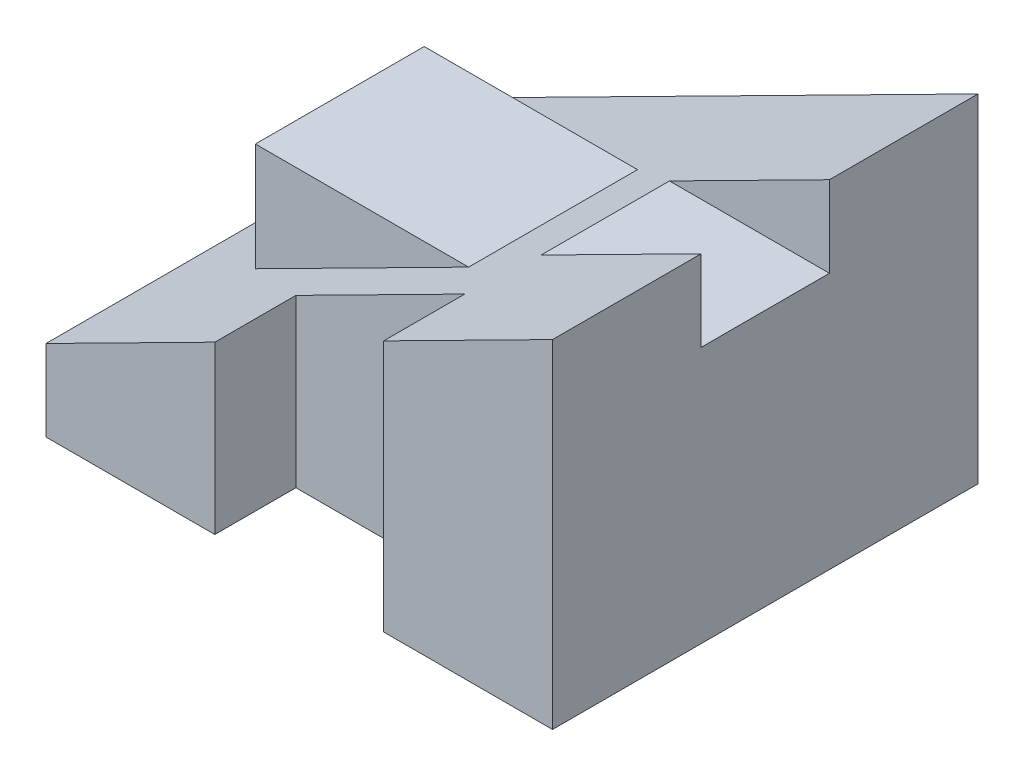
ISO-10303-21;
HEADER;
FILE_DESCRIPTION(('STEP AP214'),'2;1');
FILE_NAME('part.step','',(''),(''),'','','');
FILE_SCHEMA(('AUTOMOTIVE_DESIGN { 1 0 10303 214 1 1 1 1 }'));
ENDSEC;
DATA;
#1=APPLICATION_CONTEXT('core data for automotive mechanical design processes');
#2=APPLICATION_PROTOCOL_DEFINITION('international standard','automotive_design',2000,#1);
#3=PRODUCT_CONTEXT('',#1,'mechanical');
#4=PRODUCT('Part','Part','',(#3));
#5=PRODUCT_RELATED_PRODUCT_CATEGORY('part','',(#4));
#6=PRODUCT_DEFINITION_FORMATION('','',#4);
#7=PRODUCT_DEFINITION_CONTEXT('part definition',#1,'design');
#8=PRODUCT_DEFINITION('design','',#6,#7);
#9=PRODUCT_DEFINITION_SHAPE('','',#8);
#10=(LENGTH_UNIT() NAMED_UNIT(*) SI_UNIT(.MILLI.,.METRE.));
#11=(NAMED_UNIT(*) PLANE_ANGLE_UNIT() SI_UNIT($,.RADIAN.));
#12=(NAMED_UNIT(*) SI_UNIT($,.STERADIAN.) SOLID_ANGLE_UNIT());
#13=UNCERTAINTY_MEASURE_WITH_UNIT(LENGTH_MEASURE(1.E-05),#10,'distance_accuracy_value','');
#14=(GEOMETRIC_REPRESENTATION_CONTEXT(3) GLOBAL_UNCERTAINTY_ASSIGNED_CONTEXT((#13)) GLOBAL_UNIT_ASSIGNED_CONTEXT((#10,
#11,#12)) REPRESENTATION_CONTEXT('',''));
#15=CARTESIAN_POINT('',(0.,0.,0.));
#16=DIRECTION('',(0.,0.,1.));
#17=DIRECTION('',(1.,0.,0.));
#18=AXIS2_PLACEMENT_3D('',#15,#16,#17);
#19=CARTESIAN_POINT('',(0.,38.,-63.));
#20=DIRECTION('',(0.,1.,0.));
#21=DIRECTION('',(0.,0.,1.));
#22=AXIS2_PLACEMENT_3D('',#19,#20,#21);
#23=PLANE('',#22);
#24=DIRECTION('',(0.,0.,1.));
#25=VECTOR('',#24,1.);
#26=CARTESIAN_POINT('',(-23.6842105263158,38.,-63.));
#27=LINE('',#26,#25);
#28=CARTESIAN_POINT('',(-23.6842105263158,38.,-41.));
#29=VERTEX_POINT('',#28);
#30=CARTESIAN_POINT('',(-23.6842105263158,38.,-22.));
#31=VERTEX_POINT('',#30);
#32=EDGE_CURVE('E163',#29,#31,#27,.T.);
#33=ORIENTED_EDGE('',*,*,#32,.T.);
#34=DIRECTION('',(-1.,0.,0.));
#35=VECTOR('',#34,1.);
#36=CARTESIAN_POINT('',(0.,38.,-22.));
#37=LINE('',#36,#35);
#38=CARTESIAN_POINT('',(0.,38.,-22.));
#39=VERTEX_POINT('',#38);
#40=EDGE_CURVE('E151',#39,#31,#37,.T.);
#41=ORIENTED_EDGE('',*,*,#40,.F.);
#42=DIRECTION('',(0.,0.,1.));
#43=VECTOR('',#42,1.);
#44=CARTESIAN_POINT('',(0.,38.,-63.));
#45=LINE('',#44,#43);
#46=CARTESIAN_POINT('',(0.,38.,-41.));
#47=VERTEX_POINT('',#46);
#48=EDGE_CURVE('E161',#47,#39,#45,.T.);
#49=ORIENTED_EDGE('',*,*,#48,.F.);
#50=DIRECTION('',(-1.,0.,0.));
#51=VECTOR('',#50,1.);
#52=CARTESIAN_POINT('',(0.,38.,-41.));
#53=LINE('',#52,#51);
#54=EDGE_CURVE('E477',#47,#29,#53,.T.);
#55=ORIENTED_EDGE('',*,*,#54,.T.);
#56=EDGE_LOOP('',(#33,#41,#49,#55));
#57=FACE_BOUND('',#56,.T.);
#58=ADVANCED_FACE('F43',(#57),#23,.T.);
#59=CARTESIAN_POINT('',(-20.1584382515207,39.7863912858962,-63.));
#60=DIRECTION('',(0.451964793188669,-0.892035776030268,0.));
#61=DIRECTION('',(0.892035776030269,0.45196479318867,0.));
#62=AXIS2_PLACEMENT_3D('',#59,#60,#61);
#63=PLANE('',#62);
#64=DIRECTION('',(0.892035776030269,0.45196479318867,0.));
#65=VECTOR('',#64,1.);
#66=CARTESIAN_POINT('',(-20.1584382515207,39.7863912858962,0.));
#67=LINE('',#66,#65);
#68=CARTESIAN_POINT('',(-75.,12.,0.));
#69=VERTEX_POINT('',#68);
#70=CARTESIAN_POINT('',(-50.,24.6666666666667,0.));
#71=VERTEX_POINT('',#70);
#72=EDGE_CURVE('E202',#69,#71,#67,.T.);
#73=ORIENTED_EDGE('',*,*,#72,.T.);
#74=DIRECTION('',(0.,0.,1.));
#75=VECTOR('',#74,1.);
#76=CARTESIAN_POINT('',(-50.,24.6666666666667,-63.));
#77=LINE('',#76,#75);
#78=CARTESIAN_POINT('',(-50.,24.6666666666667,-12.));
#79=VERTEX_POINT('',#78);
#80=EDGE_CURVE('E47',#79,#71,#77,.T.);
#81=ORIENTED_EDGE('',*,*,#80,.F.);
#82=DIRECTION('',(0.892035776030269,0.45196479318867,0.));
#83=VECTOR('',#82,1.);
#84=CARTESIAN_POINT('',(-20.1584382515207,39.7863912858962,-12.));
#85=LINE('',#84,#83);
#86=CARTESIAN_POINT('',(-25.,37.3333333333333,-12.));
#87=VERTEX_POINT('',#86);
#88=EDGE_CURVE('E178',#79,#87,#85,.T.);
#89=ORIENTED_EDGE('',*,*,#88,.T.);
#90=DIRECTION('',(0.,0.,1.));
#91=VECTOR('',#90,1.);
#92=CARTESIAN_POINT('',(-25.,37.3333333333333,-63.));
#93=LINE('',#92,#91);
#94=CARTESIAN_POINT('',(-25.,37.3333333333333,0.));
#95=VERTEX_POINT('',#94);
#96=EDGE_CURVE('E171',#87,#95,#93,.T.);
#97=ORIENTED_EDGE('',*,*,#96,.T.);
#98=DIRECTION('',(0.892035776030269,0.45196479318867,0.));
#99=VECTOR('',#98,1.);
#100=CARTESIAN_POINT('',(-20.1584382515207,39.7863912858962,0.));
#101=LINE('',#100,#99);
#102=CARTESIAN_POINT('',(0.,50.,0.));
#103=VERTEX_POINT('',#102);
#104=EDGE_CURVE('E246',#95,#103,#101,.T.);
#105=ORIENTED_EDGE('',*,*,#104,.T.);
#106=DIRECTION('',(0.,0.,1.));
#107=VECTOR('',#106,1.);
#108=CARTESIAN_POINT('',(0.,50.,-22.));
#109=LINE('',#108,#107);
#110=CARTESIAN_POINT('',(0.,50.,-22.));
#111=VERTEX_POINT('',#110);
#112=EDGE_CURVE('E242',#111,#103,#109,.T.);
#113=ORIENTED_EDGE('',*,*,#112,.F.);
#114=DIRECTION('',(0.892035776030269,0.45196479318867,0.));
#115=VECTOR('',#114,1.);
#116=CARTESIAN_POINT('',(-20.1584382515207,39.7863912858962,-22.));
#117=LINE('',#116,#115);
#118=EDGE_CURVE('E153',#31,#111,#117,.T.);
#119=ORIENTED_EDGE('',*,*,#118,.F.);
#120=ORIENTED_EDGE('',*,*,#32,.F.);
#121=DIRECTION('',(0.892035776030269,0.45196479318867,0.));
#122=VECTOR('',#121,1.);
#123=CARTESIAN_POINT('',(-20.1584382515207,39.7863912858962,-41.));
#124=LINE('',#123,#122);
#125=CARTESIAN_POINT('',(0.,50.,-41.));
#126=VERTEX_POINT('',#125);
#127=EDGE_CURVE('E60',#29,#126,#124,.T.);
#128=ORIENTED_EDGE('',*,*,#127,.T.);
#129=DIRECTION('',(0.,0.,1.));
#130=VECTOR('',#129,1.);
#131=CARTESIAN_POINT('',(0.,50.,-63.));
#132=LINE('',#131,#130);
#133=CARTESIAN_POINT('',(0.,50.,-63.));
#134=VERTEX_POINT('',#133);
#135=EDGE_CURVE('E484',#134,#126,#132,.T.);
#136=ORIENTED_EDGE('',*,*,#135,.F.);
#137=DIRECTION('',(0.892035776030269,0.45196479318867,0.));
#138=VECTOR('',#137,1.);
#139=CARTESIAN_POINT('',(-20.1584382515207,39.7863912858962,-63.));
#140=LINE('',#139,#138);
#141=CARTESIAN_POINT('',(-75.,12.,-63.));
#142=VERTEX_POINT('',#141);
#143=EDGE_CURVE('E192',#142,#134,#140,.T.);
#144=ORIENTED_EDGE('',*,*,#143,.F.);
#145=DIRECTION('',(0.,0.,1.));
#146=VECTOR('',#145,1.);
#147=CARTESIAN_POINT('',(-75.,12.,-63.));
#148=LINE('',#147,#146);
#149=EDGE_CURVE('E209',#142,#69,#148,.T.);
#150=ORIENTED_EDGE('',*,*,#149,.T.);
#151=EDGE_LOOP('',(#73,#81,#89,#97,#105,#113,#119,#120,#128,#136,#144,#150));
#152=FACE_BOUND('',#151,.T.);
#153=DIRECTION('',(0.892035776030269,0.45196479318867,0.));
#154=VECTOR('',#153,1.);
#155=CARTESIAN_POINT('',(-20.1584382515207,39.7863912858962,-19.));
#156=LINE('',#155,#154);
#157=CARTESIAN_POINT('',(-63.,18.08,-19.));
#158=VERTEX_POINT('',#157);
#159=CARTESIAN_POINT('',(-31.421052631579,34.08,-19.));
#160=VERTEX_POINT('',#159);
#161=EDGE_CURVE('E68',#158,#160,#156,.T.);
#162=ORIENTED_EDGE('',*,*,#161,.F.);
#163=DIRECTION('',(0.,0.,1.));
#164=VECTOR('',#163,1.);
#165=CARTESIAN_POINT('',(-63.,18.08,-44.));
#166=LINE('',#165,#164);
#167=CARTESIAN_POINT('',(-63.,18.08,-44.));
#168=VERTEX_POINT('',#167);
#169=EDGE_CURVE('E252',#168,#158,#166,.T.);
#170=ORIENTED_EDGE('',*,*,#169,.F.);
#171=DIRECTION('',(0.892035776030269,0.45196479318867,0.));
#172=VECTOR('',#171,1.);
#173=CARTESIAN_POINT('',(-20.1584382515207,39.7863912858962,-44.));
#174=LINE('',#173,#172);
#175=CARTESIAN_POINT('',(-31.421052631579,34.08,-44.));
#176=VERTEX_POINT('',#175);
#177=EDGE_CURVE('E491',#168,#176,#174,.T.);
#178=ORIENTED_EDGE('',*,*,#177,.T.);
#179=DIRECTION('',(0.,0.,1.));
#180=VECTOR('',#179,1.);
#181=CARTESIAN_POINT('',(-31.421052631579,34.08,-44.));
#182=LINE('',#181,#180);
#183=EDGE_CURVE('E247',#176,#160,#182,.T.);
#184=ORIENTED_EDGE('',*,*,#183,.T.);
#185=EDGE_LOOP('',(#162,#170,#178,#184));
#186=FACE_BOUND('',#185,.T.);
#187=ADVANCED_FACE('F219',(#152,#186),#63,.F.);
#188=CARTESIAN_POINT('',(-50.,0.,-63.));
#189=DIRECTION('',(-1.,0.,0.));
#190=DIRECTION('',(0.,0.,1.));
#191=AXIS2_PLACEMENT_3D('',#188,#189,#190);
#192=PLANE('',#191);
#193=DIRECTION('',(0.,-1.,0.));
#194=VECTOR('',#193,1.);
#195=CARTESIAN_POINT('',(-50.,0.,-12.));
#196=LINE('',#195,#194);
#197=CARTESIAN_POINT('',(-50.,0.,-12.));
#198=VERTEX_POINT('',#197);
#199=EDGE_CURVE('E181',#79,#198,#196,.T.);
#200=ORIENTED_EDGE('',*,*,#199,.F.);
#201=ORIENTED_EDGE('',*,*,#80,.T.);
#202=DIRECTION('',(0.,-1.,0.));
#203=VECTOR('',#202,1.);
#204=CARTESIAN_POINT('',(-50.,0.,0.));
#205=LINE('',#204,#203);
#206=CARTESIAN_POINT('',(-50.,0.,0.));
#207=VERTEX_POINT('',#206);
#208=EDGE_CURVE('E191',#71,#207,#205,.T.);
#209=ORIENTED_EDGE('',*,*,#208,.T.);
#210=DIRECTION('',(0.,0.,1.));
#211=VECTOR('',#210,1.);
#212=CARTESIAN_POINT('',(-50.,0.,-63.));
#213=LINE('',#212,#211);
#214=EDGE_CURVE('E11',#198,#207,#213,.T.);
#215=ORIENTED_EDGE('',*,*,#214,.F.);
#216=EDGE_LOOP('',(#200,#201,#209,#215));
#217=FACE_BOUND('',#216,.T.);
#218=ADVANCED_FACE('F45',(#217),#192,.F.);
#219=CARTESIAN_POINT('',(0.,0.,-63.));
#220=DIRECTION('',(0.,1.,0.));
#221=DIRECTION('',(0.,0.,1.));
#222=AXIS2_PLACEMENT_3D('',#219,#220,#221);
#223=PLANE('',#222);
#224=DIRECTION('',(-1.,0.,0.));
#225=VECTOR('',#224,1.);
#226=CARTESIAN_POINT('',(0.,0.,0.));
#227=LINE('',#226,#225);
#228=CARTESIAN_POINT('',(-75.,0.,0.));
#229=VERTEX_POINT('',#228);
#230=EDGE_CURVE('E196',#207,#229,#227,.T.);
#231=ORIENTED_EDGE('',*,*,#230,.T.);
#232=DIRECTION('',(0.,0.,1.));
#233=VECTOR('',#232,1.);
#234=CARTESIAN_POINT('',(-75.,0.,-63.));
#235=LINE('',#234,#233);
#236=CARTESIAN_POINT('',(-75.,0.,-63.));
#237=VERTEX_POINT('',#236);
#238=EDGE_CURVE('E52',#237,#229,#235,.T.);
#239=ORIENTED_EDGE('',*,*,#238,.F.);
#240=DIRECTION('',(-1.,0.,0.));
#241=VECTOR('',#240,1.);
#242=CARTESIAN_POINT('',(0.,0.,-63.));
#243=LINE('',#242,#241);
#244=CARTESIAN_POINT('',(0.,0.,-63.));
#245=VERTEX_POINT('',#244);
#246=EDGE_CURVE('E198',#245,#237,#243,.T.);
#247=ORIENTED_EDGE('',*,*,#246,.F.);
#248=DIRECTION('',(0.,0.,1.));
#249=VECTOR('',#248,1.);
#250=CARTESIAN_POINT('',(0.,0.,-63.));
#251=LINE('',#250,#249);
#252=CARTESIAN_POINT('',(0.,0.,0.));
#253=VERTEX_POINT('',#252);
#254=EDGE_CURVE('E182',#245,#253,#251,.T.);
#255=ORIENTED_EDGE('',*,*,#254,.T.);
#256=DIRECTION('',(-1.,0.,0.));
#257=VECTOR('',#256,1.);
#258=CARTESIAN_POINT('',(0.,0.,0.));
#259=LINE('',#258,#257);
#260=CARTESIAN_POINT('',(-25.,0.,0.));
#261=VERTEX_POINT('',#260);
#262=EDGE_CURVE('E174',#253,#261,#259,.T.);
#263=ORIENTED_EDGE('',*,*,#262,.T.);
#264=DIRECTION('',(0.,0.,1.));
#265=VECTOR('',#264,1.);
#266=CARTESIAN_POINT('',(-25.,0.,-63.));
#267=LINE('',#266,#265);
#268=CARTESIAN_POINT('',(-25.,0.,-12.));
#269=VERTEX_POINT('',#268);
#270=EDGE_CURVE('E239',#269,#261,#267,.T.);
#271=ORIENTED_EDGE('',*,*,#270,.F.);
#272=DIRECTION('',(-1.,0.,0.));
#273=VECTOR('',#272,1.);
#274=CARTESIAN_POINT('',(0.,0.,-12.));
#275=LINE('',#274,#273);
#276=EDGE_CURVE('E185',#269,#198,#275,.T.);
#277=ORIENTED_EDGE('',*,*,#276,.T.);
#278=ORIENTED_EDGE('',*,*,#214,.T.);
#279=EDGE_LOOP('',(#231,#239,#247,#255,#263,#271,#277,#278));
#280=FACE_BOUND('',#279,.T.);
#281=ADVANCED_FACE('F227',(#280),#223,.F.);
#282=CARTESIAN_POINT('',(-75.,0.,-63.));
#283=DIRECTION('',(1.,0.,0.));
#284=DIRECTION('',(0.,0.,-1.));
#285=AXIS2_PLACEMENT_3D('',#282,#283,#284);
#286=PLANE('',#285);
#287=DIRECTION('',(0.,1.,0.));
#288=VECTOR('',#287,1.);
#289=CARTESIAN_POINT('',(-75.,0.,0.));
#290=LINE('',#289,#288);
#291=EDGE_CURVE('E205',#229,#69,#290,.T.);
#292=ORIENTED_EDGE('',*,*,#291,.T.);
#293=ORIENTED_EDGE('',*,*,#149,.F.);
#294=DIRECTION('',(0.,1.,0.));
#295=VECTOR('',#294,1.);
#296=CARTESIAN_POINT('',(-75.,0.,-63.));
#297=LINE('',#296,#295);
#298=EDGE_CURVE('E195',#237,#142,#297,.T.);
#299=ORIENTED_EDGE('',*,*,#298,.F.);
#300=ORIENTED_EDGE('',*,*,#238,.T.);
#301=EDGE_LOOP('',(#292,#293,#299,#300));
#302=FACE_BOUND('',#301,.T.);
#303=ADVANCED_FACE('F230',(#302),#286,.F.);
#304=CARTESIAN_POINT('',(0.,0.,-63.));
#305=DIRECTION('',(0.,0.,1.));
#306=DIRECTION('',(1.,0.,0.));
#307=AXIS2_PLACEMENT_3D('',#304,#305,#306);
#308=PLANE('',#307);
#309=ORIENTED_EDGE('',*,*,#143,.T.);
#310=DIRECTION('',(0.,-1.,0.));
#311=VECTOR('',#310,1.);
#312=CARTESIAN_POINT('',(0.,0.,-63.));
#313=LINE('',#312,#311);
#314=EDGE_CURVE('E169',#134,#245,#313,.T.);
#315=ORIENTED_EDGE('',*,*,#314,.T.);
#316=ORIENTED_EDGE('',*,*,#246,.T.);
#317=ORIENTED_EDGE('',*,*,#298,.T.);
#318=EDGE_LOOP('',(#309,#315,#316,#317));
#319=FACE_BOUND('',#318,.T.);
#320=ADVANCED_FACE('F232',(#319),#308,.F.);
#321=CARTESIAN_POINT('',(0.,0.,0.));
#322=DIRECTION('',(0.,0.,1.));
#323=DIRECTION('',(1.,0.,0.));
#324=AXIS2_PLACEMENT_3D('',#321,#322,#323);
#325=PLANE('',#324);
#326=ORIENTED_EDGE('',*,*,#208,.F.);
#327=ORIENTED_EDGE('',*,*,#72,.F.);
#328=ORIENTED_EDGE('',*,*,#291,.F.);
#329=ORIENTED_EDGE('',*,*,#230,.F.);
#330=EDGE_LOOP('',(#326,#327,#328,#329));
#331=FACE_BOUND('',#330,.T.);
#332=ADVANCED_FACE('F224',(#331),#325,.T.);
#333=CARTESIAN_POINT('',(0.,0.,-12.));
#334=DIRECTION('',(0.,0.,1.));
#335=DIRECTION('',(1.,0.,0.));
#336=AXIS2_PLACEMENT_3D('',#333,#334,#335);
#337=PLANE('',#336);
#338=ORIENTED_EDGE('',*,*,#88,.F.);
#339=ORIENTED_EDGE('',*,*,#199,.T.);
#340=ORIENTED_EDGE('',*,*,#276,.F.);
#341=DIRECTION('',(0.,-1.,0.));
#342=VECTOR('',#341,1.);
#343=CARTESIAN_POINT('',(-25.,0.,-12.));
#344=LINE('',#343,#342);
#345=EDGE_CURVE('E188',#87,#269,#344,.T.);
#346=ORIENTED_EDGE('',*,*,#345,.F.);
#347=EDGE_LOOP('',(#338,#339,#340,#346));
#348=FACE_BOUND('',#347,.T.);
#349=ADVANCED_FACE('F264',(#348),#337,.T.);
#350=CARTESIAN_POINT('',(0.,0.,-63.));
#351=DIRECTION('',(-1.,0.,0.));
#352=DIRECTION('',(0.,-1.,0.));
#353=AXIS2_PLACEMENT_3D('',#350,#351,#352);
#354=PLANE('',#353);
#355=DIRECTION('',(0.,-1.,0.));
#356=VECTOR('',#355,1.);
#357=CARTESIAN_POINT('',(0.,0.,0.));
#358=LINE('',#357,#356);
#359=EDGE_CURVE('E241',#103,#253,#358,.T.);
#360=ORIENTED_EDGE('',*,*,#359,.T.);
#361=ORIENTED_EDGE('',*,*,#254,.F.);
#362=ORIENTED_EDGE('',*,*,#314,.F.);
#363=ORIENTED_EDGE('',*,*,#135,.T.);
#364=DIRECTION('',(0.,-1.,0.));
#365=VECTOR('',#364,1.);
#366=CARTESIAN_POINT('',(0.,0.,-41.));
#367=LINE('',#366,#365);
#368=EDGE_CURVE('E168',#126,#47,#367,.T.);
#369=ORIENTED_EDGE('',*,*,#368,.T.);
#370=ORIENTED_EDGE('',*,*,#48,.T.);
#371=DIRECTION('',(0.,-1.,0.));
#372=VECTOR('',#371,1.);
#373=CARTESIAN_POINT('',(0.,0.,-22.));
#374=LINE('',#373,#372);
#375=EDGE_CURVE('E148',#111,#39,#374,.T.);
#376=ORIENTED_EDGE('',*,*,#375,.F.);
#377=ORIENTED_EDGE('',*,*,#112,.T.);
#378=EDGE_LOOP('',(#360,#361,#362,#363,#369,#370,#376,#377));
#379=FACE_BOUND('',#378,.T.);
#380=ADVANCED_FACE('F166',(#379),#354,.F.);
#381=CARTESIAN_POINT('',(-25.,0.,-63.));
#382=DIRECTION('',(-1.,0.,0.));
#383=DIRECTION('',(0.,-1.,0.));
#384=AXIS2_PLACEMENT_3D('',#381,#382,#383);
#385=PLANE('',#384);
#386=ORIENTED_EDGE('',*,*,#96,.F.);
#387=ORIENTED_EDGE('',*,*,#345,.T.);
#388=ORIENTED_EDGE('',*,*,#270,.T.);
#389=DIRECTION('',(0.,-1.,0.));
#390=VECTOR('',#389,1.);
#391=CARTESIAN_POINT('',(-25.,0.,0.));
#392=LINE('',#391,#390);
#393=EDGE_CURVE('E249',#95,#261,#392,.T.);
#394=ORIENTED_EDGE('',*,*,#393,.F.);
#395=EDGE_LOOP('',(#386,#387,#388,#394));
#396=FACE_BOUND('',#395,.T.);
#397=ADVANCED_FACE('F262',(#396),#385,.T.);
#398=CARTESIAN_POINT('',(0.,0.,0.));
#399=DIRECTION('',(0.,0.,1.));
#400=DIRECTION('',(1.,0.,0.));
#401=AXIS2_PLACEMENT_3D('',#398,#399,#400);
#402=PLANE('',#401);
#403=ORIENTED_EDGE('',*,*,#359,.F.);
#404=ORIENTED_EDGE('',*,*,#104,.F.);
#405=ORIENTED_EDGE('',*,*,#393,.T.);
#406=ORIENTED_EDGE('',*,*,#262,.F.);
#407=EDGE_LOOP('',(#403,#404,#405,#406));
#408=FACE_BOUND('',#407,.T.);
#409=ADVANCED_FACE('F261',(#408),#402,.T.);
#410=CARTESIAN_POINT('',(0.,34.08,-44.));
#411=DIRECTION('',(0.,-1.,0.));
#412=DIRECTION('',(0.,0.,-1.));
#413=AXIS2_PLACEMENT_3D('',#410,#411,#412);
#414=PLANE('',#413);
#415=DIRECTION('',(1.,0.,0.));
#416=VECTOR('',#415,1.);
#417=CARTESIAN_POINT('',(0.,34.08,-19.));
#418=LINE('',#417,#416);
#419=CARTESIAN_POINT('',(-63.,34.08,-19.));
#420=VERTEX_POINT('',#419);
#421=EDGE_CURVE('E486',#420,#160,#418,.T.);
#422=ORIENTED_EDGE('',*,*,#421,.T.);
#423=ORIENTED_EDGE('',*,*,#183,.F.);
#424=DIRECTION('',(1.,0.,0.));
#425=VECTOR('',#424,1.);
#426=CARTESIAN_POINT('',(0.,34.08,-44.));
#427=LINE('',#426,#425);
#428=CARTESIAN_POINT('',(-63.,34.08,-44.));
#429=VERTEX_POINT('',#428);
#430=EDGE_CURVE('E487',#429,#176,#427,.T.);
#431=ORIENTED_EDGE('',*,*,#430,.F.);
#432=DIRECTION('',(0.,0.,1.));
#433=VECTOR('',#432,1.);
#434=CARTESIAN_POINT('',(-63.,34.08,-44.));
#435=LINE('',#434,#433);
#436=EDGE_CURVE('E494',#429,#420,#435,.T.);
#437=ORIENTED_EDGE('',*,*,#436,.T.);
#438=EDGE_LOOP('',(#422,#423,#431,#437));
#439=FACE_BOUND('',#438,.T.);
#440=ADVANCED_FACE('F284',(#439),#414,.F.);
#441=CARTESIAN_POINT('',(-63.,0.,-44.));
#442=DIRECTION('',(1.,0.,0.));
#443=DIRECTION('',(0.,0.,-1.));
#444=AXIS2_PLACEMENT_3D('',#441,#442,#443);
#445=PLANE('',#444);
#446=DIRECTION('',(0.,1.,0.));
#447=VECTOR('',#446,1.);
#448=CARTESIAN_POINT('',(-63.,0.,-19.));
#449=LINE('',#448,#447);
#450=EDGE_CURVE('E496',#158,#420,#449,.T.);
#451=ORIENTED_EDGE('',*,*,#450,.T.);
#452=ORIENTED_EDGE('',*,*,#436,.F.);
#453=DIRECTION('',(0.,1.,0.));
#454=VECTOR('',#453,1.);
#455=CARTESIAN_POINT('',(-63.,0.,-44.));
#456=LINE('',#455,#454);
#457=EDGE_CURVE('E489',#168,#429,#456,.T.);
#458=ORIENTED_EDGE('',*,*,#457,.F.);
#459=ORIENTED_EDGE('',*,*,#169,.T.);
#460=EDGE_LOOP('',(#451,#452,#458,#459));
#461=FACE_BOUND('',#460,.T.);
#462=ADVANCED_FACE('F287',(#461),#445,.F.);
#463=CARTESIAN_POINT('',(0.,0.,-44.));
#464=DIRECTION('',(0.,0.,1.));
#465=DIRECTION('',(1.,0.,0.));
#466=AXIS2_PLACEMENT_3D('',#463,#464,#465);
#467=PLANE('',#466);
#468=ORIENTED_EDGE('',*,*,#430,.T.);
#469=ORIENTED_EDGE('',*,*,#177,.F.);
#470=ORIENTED_EDGE('',*,*,#457,.T.);
#471=EDGE_LOOP('',(#468,#469,#470));
#472=FACE_BOUND('',#471,.T.);
#473=ADVANCED_FACE('F291',(#472),#467,.F.);
#474=CARTESIAN_POINT('',(0.,0.,-19.));
#475=DIRECTION('',(0.,0.,1.));
#476=DIRECTION('',(1.,0.,0.));
#477=AXIS2_PLACEMENT_3D('',#474,#475,#476);
#478=PLANE('',#477);
#479=ORIENTED_EDGE('',*,*,#421,.F.);
#480=ORIENTED_EDGE('',*,*,#450,.F.);
#481=ORIENTED_EDGE('',*,*,#161,.T.);
#482=EDGE_LOOP('',(#479,#480,#481));
#483=FACE_BOUND('',#482,.T.);
#484=ADVANCED_FACE('F293',(#483),#478,.T.);
#485=CARTESIAN_POINT('',(0.,0.,-41.));
#486=DIRECTION('',(0.,0.,1.));
#487=DIRECTION('',(1.,0.,0.));
#488=AXIS2_PLACEMENT_3D('',#485,#486,#487);
#489=PLANE('',#488);
#490=ORIENTED_EDGE('',*,*,#54,.F.);
#491=ORIENTED_EDGE('',*,*,#368,.F.);
#492=ORIENTED_EDGE('',*,*,#127,.F.);
#493=EDGE_LOOP('',(#490,#491,#492));
#494=FACE_BOUND('',#493,.T.);
#495=ADVANCED_FACE('F296',(#494),#489,.T.);
#496=CARTESIAN_POINT('',(0.,0.,-22.));
#497=DIRECTION('',(0.,0.,1.));
#498=DIRECTION('',(1.,0.,0.));
#499=AXIS2_PLACEMENT_3D('',#496,#497,#498);
#500=PLANE('',#499);
#501=ORIENTED_EDGE('',*,*,#40,.T.);
#502=ORIENTED_EDGE('',*,*,#118,.T.);
#503=ORIENTED_EDGE('',*,*,#375,.T.);
#504=EDGE_LOOP('',(#501,#502,#503));
#505=FACE_BOUND('',#504,.T.);
#506=ADVANCED_FACE('F150',(#505),#500,.F.);
#507=CLOSED_SHELL('',(#58,#187,#218,#281,#303,#320,#332,#349,#380,#397,#409,#440,#462,#473,#484,
#495,#506));
#508=MANIFOLD_SOLID_BREP('B2',#507);
#509=ADVANCED_BREP_SHAPE_REPRESENTATION('',(#18,#508),#14);
#510=SHAPE_DEFINITION_REPRESENTATION(#9,#509);
ENDSEC;
END-ISO-10303-21;
